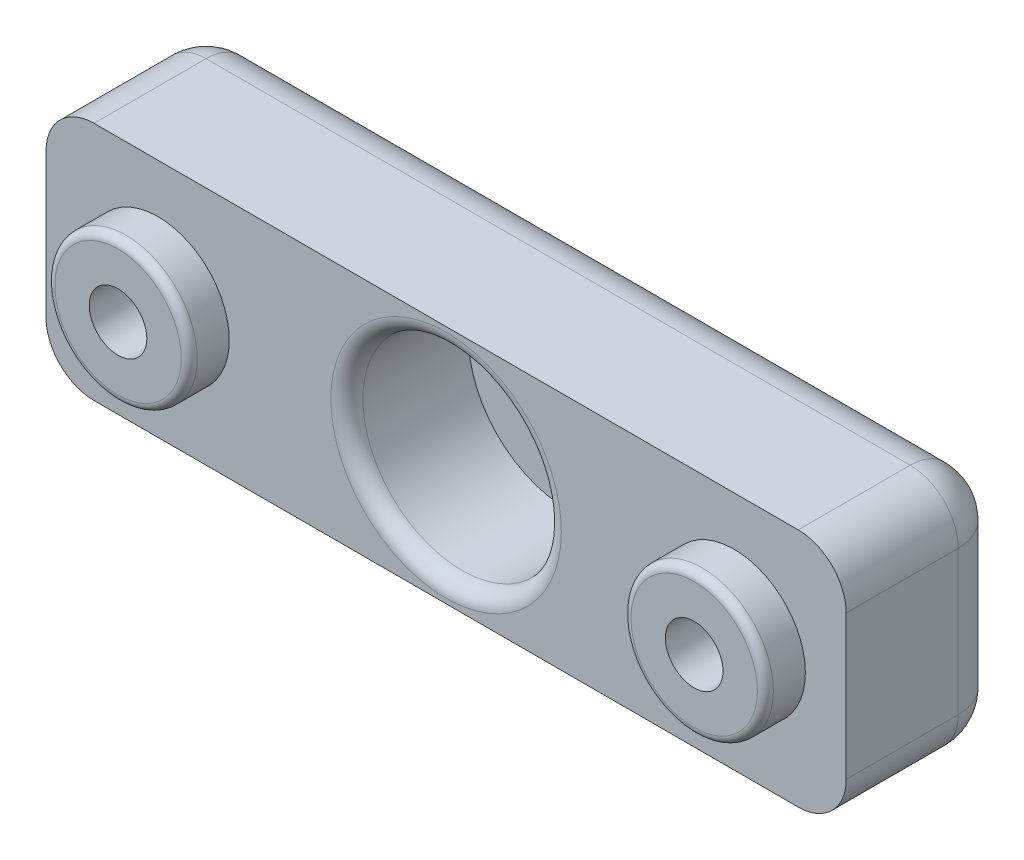
ISO-10303-21;
HEADER;
FILE_DESCRIPTION(('STEP AP214'),'2;1');
FILE_NAME('part.step','',(''),(''),'','','');
FILE_SCHEMA(('AUTOMOTIVE_DESIGN { 1 0 10303 214 1 1 1 1 }'));
ENDSEC;
DATA;
#1=APPLICATION_CONTEXT('core data for automotive mechanical design processes');
#2=APPLICATION_PROTOCOL_DEFINITION('international standard','automotive_design',2000,#1);
#3=PRODUCT_CONTEXT('',#1,'mechanical');
#4=PRODUCT('Part','Part','',(#3));
#5=PRODUCT_RELATED_PRODUCT_CATEGORY('part','',(#4));
#6=PRODUCT_DEFINITION_FORMATION('','',#4);
#7=PRODUCT_DEFINITION_CONTEXT('part definition',#1,'design');
#8=PRODUCT_DEFINITION('design','',#6,#7);
#9=PRODUCT_DEFINITION_SHAPE('','',#8);
#10=(LENGTH_UNIT() NAMED_UNIT(*) SI_UNIT(.MILLI.,.METRE.));
#11=(NAMED_UNIT(*) PLANE_ANGLE_UNIT() SI_UNIT($,.RADIAN.));
#12=(NAMED_UNIT(*) SI_UNIT($,.STERADIAN.) SOLID_ANGLE_UNIT());
#13=UNCERTAINTY_MEASURE_WITH_UNIT(LENGTH_MEASURE(1.E-05),#10,'distance_accuracy_value','');
#14=(GEOMETRIC_REPRESENTATION_CONTEXT(3) GLOBAL_UNCERTAINTY_ASSIGNED_CONTEXT((#13)) GLOBAL_UNIT_ASSIGNED_CONTEXT((#10,
#11,#12)) REPRESENTATION_CONTEXT('',''));
#15=CARTESIAN_POINT('',(0.,0.,0.));
#16=DIRECTION('',(0.,0.,1.));
#17=DIRECTION('',(1.,0.,0.));
#18=AXIS2_PLACEMENT_3D('',#15,#16,#17);
#19=CARTESIAN_POINT('',(-20.4300132750273,8.59792284866469,-3.));
#20=DIRECTION('',(0.,0.,1.));
#21=DIRECTION('',(1.,0.,0.));
#22=AXIS2_PLACEMENT_3D('',#19,#20,#21);
#23=CYLINDRICAL_SURFACE('',#22,1.8);
#24=CARTESIAN_POINT('',(-20.4300132750273,8.59792284866469,12.5));
#25=DIRECTION('',(0.,0.,1.));
#26=DIRECTION('',(1.,0.,0.));
#27=AXIS2_PLACEMENT_3D('',#24,#25,#26);
#28=CIRCLE('',#27,1.8);
#29=CARTESIAN_POINT('',(-18.6300132750273,8.59792284866469,12.5));
#30=VERTEX_POINT('',#29);
#31=EDGE_CURVE('E297',#30,#30,#28,.T.);
#32=ORIENTED_EDGE('',*,*,#31,.T.);
#33=EDGE_LOOP('',(#32));
#34=FACE_BOUND('',#33,.T.);
#35=CARTESIAN_POINT('',(-20.4300132750273,8.59792284866469,3.5));
#36=DIRECTION('',(0.,0.,-1.));
#37=DIRECTION('',(-1.,0.,0.));
#38=AXIS2_PLACEMENT_3D('',#35,#36,#37);
#39=CIRCLE('',#38,1.8);
#40=CARTESIAN_POINT('',(-22.2300132750273,8.59792284866469,3.5));
#41=VERTEX_POINT('',#40);
#42=EDGE_CURVE('E237',#41,#41,#39,.F.);
#43=ORIENTED_EDGE('',*,*,#42,.F.);
#44=EDGE_LOOP('',(#43));
#45=FACE_BOUND('',#44,.T.);
#46=ADVANCED_FACE('F35',(#34,#45),#23,.F.);
#47=CARTESIAN_POINT('',(15.5699867249727,8.59792284866469,-3.));
#48=DIRECTION('',(0.,0.,1.));
#49=DIRECTION('',(1.,0.,0.));
#50=AXIS2_PLACEMENT_3D('',#47,#48,#49);
#51=CYLINDRICAL_SURFACE('',#50,1.8);
#52=CARTESIAN_POINT('',(15.5699867249727,8.59792284866469,12.5));
#53=DIRECTION('',(0.,0.,1.));
#54=DIRECTION('',(1.,0.,0.));
#55=AXIS2_PLACEMENT_3D('',#52,#53,#54);
#56=CIRCLE('',#55,1.8);
#57=CARTESIAN_POINT('',(17.3699867249727,8.59792284866469,12.5));
#58=VERTEX_POINT('',#57);
#59=EDGE_CURVE('E294',#58,#58,#56,.T.);
#60=ORIENTED_EDGE('',*,*,#59,.T.);
#61=EDGE_LOOP('',(#60));
#62=FACE_BOUND('',#61,.T.);
#63=CARTESIAN_POINT('',(15.5699867249727,8.59792284866469,3.5));
#64=DIRECTION('',(0.,0.,-1.));
#65=DIRECTION('',(-1.,0.,0.));
#66=AXIS2_PLACEMENT_3D('',#63,#64,#65);
#67=CIRCLE('',#66,1.8);
#68=CARTESIAN_POINT('',(13.7699867249727,8.59792284866469,3.5));
#69=VERTEX_POINT('',#68);
#70=EDGE_CURVE('E283',#69,#69,#67,.F.);
#71=ORIENTED_EDGE('',*,*,#70,.F.);
#72=EDGE_LOOP('',(#71));
#73=FACE_BOUND('',#72,.T.);
#74=ADVANCED_FACE('F425',(#62,#73),#51,.F.);
#75=CARTESIAN_POINT('',(-27.4300132750273,16.0979228486647,10.));
#76=DIRECTION('',(1.,0.,0.));
#77=DIRECTION('',(0.,1.,0.));
#78=AXIS2_PLACEMENT_3D('',#75,#76,#77);
#79=PLANE('',#78);
#80=DIRECTION('',(0.,-1.,0.));
#81=VECTOR('',#80,1.);
#82=CARTESIAN_POINT('',(-27.4300132750273,16.0979228486647,3.));
#83=LINE('',#82,#81);
#84=CARTESIAN_POINT('',(-27.4300132750273,13.0979228486647,3.));
#85=VERTEX_POINT('',#84);
#86=CARTESIAN_POINT('',(-27.4300132750273,4.09792284866469,3.));
#87=VERTEX_POINT('',#86);
#88=EDGE_CURVE('E50',#85,#87,#83,.T.);
#89=ORIENTED_EDGE('',*,*,#88,.T.);
#90=DIRECTION('',(0.,0.,-1.));
#91=VECTOR('',#90,1.);
#92=CARTESIAN_POINT('',(-27.4300132750273,4.09792284866469,10.));
#93=LINE('',#92,#91);
#94=CARTESIAN_POINT('',(-27.4300132750273,4.09792284866469,10.));
#95=VERTEX_POINT('',#94);
#96=EDGE_CURVE('E363',#87,#95,#93,.F.);
#97=ORIENTED_EDGE('',*,*,#96,.T.);
#98=DIRECTION('',(0.,-1.,0.));
#99=VECTOR('',#98,1.);
#100=CARTESIAN_POINT('',(-27.4300132750273,16.0979228486647,10.));
#101=LINE('',#100,#99);
#102=CARTESIAN_POINT('',(-27.4300132750273,13.0979228486647,10.));
#103=VERTEX_POINT('',#102);
#104=EDGE_CURVE('E309',#103,#95,#101,.T.);
#105=ORIENTED_EDGE('',*,*,#104,.F.);
#106=DIRECTION('',(0.,0.,-1.));
#107=VECTOR('',#106,1.);
#108=CARTESIAN_POINT('',(-27.4300132750273,13.0979228486647,10.));
#109=LINE('',#108,#107);
#110=EDGE_CURVE('E55',#103,#85,#109,.T.);
#111=ORIENTED_EDGE('',*,*,#110,.T.);
#112=EDGE_LOOP('',(#89,#97,#105,#111));
#113=FACE_BOUND('',#112,.T.);
#114=ADVANCED_FACE('F431',(#113),#79,.F.);
#115=CARTESIAN_POINT('',(-27.4300132750273,1.09792284866469,10.));
#116=DIRECTION('',(0.,1.,0.));
#117=DIRECTION('',(0.,0.,1.));
#118=AXIS2_PLACEMENT_3D('',#115,#116,#117);
#119=PLANE('',#118);
#120=DIRECTION('',(1.,0.,0.));
#121=VECTOR('',#120,1.);
#122=CARTESIAN_POINT('',(-27.4300132750273,1.09792284866469,3.));
#123=LINE('',#122,#121);
#124=CARTESIAN_POINT('',(-24.4300132750273,1.09792284866469,3.));
#125=VERTEX_POINT('',#124);
#126=CARTESIAN_POINT('',(19.5699867249727,1.09792284866469,3.));
#127=VERTEX_POINT('',#126);
#128=EDGE_CURVE('E327',#125,#127,#123,.T.);
#129=ORIENTED_EDGE('',*,*,#128,.T.);
#130=DIRECTION('',(0.,0.,-1.));
#131=VECTOR('',#130,1.);
#132=CARTESIAN_POINT('',(19.5699867249727,1.09792284866469,10.));
#133=LINE('',#132,#131);
#134=CARTESIAN_POINT('',(19.5699867249727,1.09792284866469,10.));
#135=VERTEX_POINT('',#134);
#136=EDGE_CURVE('E330',#127,#135,#133,.F.);
#137=ORIENTED_EDGE('',*,*,#136,.T.);
#138=DIRECTION('',(1.,0.,0.));
#139=VECTOR('',#138,1.);
#140=CARTESIAN_POINT('',(-27.4300132750273,1.09792284866469,10.));
#141=LINE('',#140,#139);
#142=CARTESIAN_POINT('',(-24.4300132750273,1.09792284866469,10.));
#143=VERTEX_POINT('',#142);
#144=EDGE_CURVE('E312',#143,#135,#141,.T.);
#145=ORIENTED_EDGE('',*,*,#144,.F.);
#146=DIRECTION('',(0.,0.,-1.));
#147=VECTOR('',#146,1.);
#148=CARTESIAN_POINT('',(-24.4300132750273,1.09792284866469,10.));
#149=LINE('',#148,#147);
#150=EDGE_CURVE('E321',#143,#125,#149,.T.);
#151=ORIENTED_EDGE('',*,*,#150,.T.);
#152=EDGE_LOOP('',(#129,#137,#145,#151));
#153=FACE_BOUND('',#152,.T.);
#154=ADVANCED_FACE('F475',(#153),#119,.F.);
#155=CARTESIAN_POINT('',(22.5699867249727,16.0979228486647,10.));
#156=DIRECTION('',(-1.,0.,0.));
#157=DIRECTION('',(0.,-1.,0.));
#158=AXIS2_PLACEMENT_3D('',#155,#156,#157);
#159=PLANE('',#158);
#160=DIRECTION('',(0.,1.,0.));
#161=VECTOR('',#160,1.);
#162=CARTESIAN_POINT('',(22.5699867249727,16.0979228486647,10.));
#163=LINE('',#162,#161);
#164=CARTESIAN_POINT('',(22.5699867249727,4.09792284866469,10.));
#165=VERTEX_POINT('',#164);
#166=CARTESIAN_POINT('',(22.5699867249727,13.0979228486647,10.));
#167=VERTEX_POINT('',#166);
#168=EDGE_CURVE('E315',#165,#167,#163,.T.);
#169=ORIENTED_EDGE('',*,*,#168,.F.);
#170=DIRECTION('',(0.,0.,-1.));
#171=VECTOR('',#170,1.);
#172=CARTESIAN_POINT('',(22.5699867249727,4.09792284866469,10.));
#173=LINE('',#172,#171);
#174=CARTESIAN_POINT('',(22.5699867249727,4.09792284866469,3.));
#175=VERTEX_POINT('',#174);
#176=EDGE_CURVE('E345',#165,#175,#173,.T.);
#177=ORIENTED_EDGE('',*,*,#176,.T.);
#178=DIRECTION('',(0.,1.,0.));
#179=VECTOR('',#178,1.);
#180=CARTESIAN_POINT('',(22.5699867249727,16.0979228486647,3.));
#181=LINE('',#180,#179);
#182=CARTESIAN_POINT('',(22.5699867249727,13.0979228486647,3.));
#183=VERTEX_POINT('',#182);
#184=EDGE_CURVE('E341',#175,#183,#181,.T.);
#185=ORIENTED_EDGE('',*,*,#184,.T.);
#186=DIRECTION('',(0.,0.,-1.));
#187=VECTOR('',#186,1.);
#188=CARTESIAN_POINT('',(22.5699867249727,13.0979228486647,10.));
#189=LINE('',#188,#187);
#190=EDGE_CURVE('E343',#183,#167,#189,.F.);
#191=ORIENTED_EDGE('',*,*,#190,.T.);
#192=EDGE_LOOP('',(#169,#177,#185,#191));
#193=FACE_BOUND('',#192,.T.);
#194=ADVANCED_FACE('F471',(#193),#159,.F.);
#195=CARTESIAN_POINT('',(-27.4300132750273,16.0979228486647,10.));
#196=DIRECTION('',(0.,-1.,0.));
#197=DIRECTION('',(0.,0.,-1.));
#198=AXIS2_PLACEMENT_3D('',#195,#196,#197);
#199=PLANE('',#198);
#200=DIRECTION('',(-1.,0.,0.));
#201=VECTOR('',#200,1.);
#202=CARTESIAN_POINT('',(-27.4300132750273,16.0979228486647,10.));
#203=LINE('',#202,#201);
#204=CARTESIAN_POINT('',(19.5699867249727,16.0979228486647,10.));
#205=VERTEX_POINT('',#204);
#206=CARTESIAN_POINT('',(-24.4300132750273,16.0979228486647,10.));
#207=VERTEX_POINT('',#206);
#208=EDGE_CURVE('E318',#205,#207,#203,.T.);
#209=ORIENTED_EDGE('',*,*,#208,.F.);
#210=DIRECTION('',(0.,0.,-1.));
#211=VECTOR('',#210,1.);
#212=CARTESIAN_POINT('',(19.5699867249727,16.0979228486647,10.));
#213=LINE('',#212,#211);
#214=CARTESIAN_POINT('',(19.5699867249727,16.0979228486647,3.));
#215=VERTEX_POINT('',#214);
#216=EDGE_CURVE('E359',#205,#215,#213,.T.);
#217=ORIENTED_EDGE('',*,*,#216,.T.);
#218=DIRECTION('',(-1.,0.,0.));
#219=VECTOR('',#218,1.);
#220=CARTESIAN_POINT('',(-27.4300132750273,16.0979228486647,3.));
#221=LINE('',#220,#219);
#222=CARTESIAN_POINT('',(-24.4300132750273,16.0979228486647,3.));
#223=VERTEX_POINT('',#222);
#224=EDGE_CURVE('E355',#215,#223,#221,.T.);
#225=ORIENTED_EDGE('',*,*,#224,.T.);
#226=DIRECTION('',(0.,0.,-1.));
#227=VECTOR('',#226,1.);
#228=CARTESIAN_POINT('',(-24.4300132750273,16.0979228486647,10.));
#229=LINE('',#228,#227);
#230=EDGE_CURVE('E357',#223,#207,#229,.F.);
#231=ORIENTED_EDGE('',*,*,#230,.T.);
#232=EDGE_LOOP('',(#209,#217,#225,#231));
#233=FACE_BOUND('',#232,.T.);
#234=ADVANCED_FACE('F464',(#233),#199,.F.);
#235=CARTESIAN_POINT('',(0.,0.,10.));
#236=DIRECTION('',(0.,0.,1.));
#237=DIRECTION('',(1.,0.,0.));
#238=AXIS2_PLACEMENT_3D('',#235,#236,#237);
#239=PLANE('',#238);
#240=CARTESIAN_POINT('',(-2.43001327502733,8.59792284866469,10.));
#241=DIRECTION('',(0.,0.,1.));
#242=DIRECTION('',(1.,0.,0.));
#243=AXIS2_PLACEMENT_3D('',#240,#241,#242);
#244=CIRCLE('',#243,7.2);
#245=CARTESIAN_POINT('',(4.76998672497267,8.59792284866469,10.));
#246=VERTEX_POINT('',#245);
#247=EDGE_CURVE('E401',#246,#246,#244,.F.);
#248=ORIENTED_EDGE('',*,*,#247,.T.);
#249=EDGE_LOOP('',(#248));
#250=FACE_BOUND('',#249,.T.);
#251=CARTESIAN_POINT('',(15.5699867249727,8.59792284866469,10.));
#252=DIRECTION('',(0.,0.,1.));
#253=DIRECTION('',(1.,0.,0.));
#254=AXIS2_PLACEMENT_3D('',#251,#252,#253);
#255=CIRCLE('',#254,4.45);
#256=CARTESIAN_POINT('',(20.0199867249727,8.59792284866469,10.));
#257=VERTEX_POINT('',#256);
#258=EDGE_CURVE('E303',#257,#257,#255,.T.);
#259=ORIENTED_EDGE('',*,*,#258,.F.);
#260=EDGE_LOOP('',(#259));
#261=FACE_BOUND('',#260,.T.);
#262=CARTESIAN_POINT('',(-20.4300132750273,8.59792284866469,10.));
#263=DIRECTION('',(0.,0.,1.));
#264=DIRECTION('',(1.,0.,0.));
#265=AXIS2_PLACEMENT_3D('',#262,#263,#264);
#266=CIRCLE('',#265,4.45);
#267=CARTESIAN_POINT('',(-15.9800132750273,8.59792284866469,10.));
#268=VERTEX_POINT('',#267);
#269=EDGE_CURVE('E306',#268,#268,#266,.T.);
#270=ORIENTED_EDGE('',*,*,#269,.F.);
#271=EDGE_LOOP('',(#270));
#272=FACE_BOUND('',#271,.T.);
#273=ORIENTED_EDGE('',*,*,#144,.T.);
#274=CARTESIAN_POINT('',(19.5699867249727,4.09792284866469,10.));
#275=DIRECTION('',(0.,0.,1.));
#276=DIRECTION('',(1.,0.,0.));
#277=AXIS2_PLACEMENT_3D('',#274,#275,#276);
#278=CIRCLE('',#277,3.);
#279=EDGE_CURVE('E353',#135,#165,#278,.T.);
#280=ORIENTED_EDGE('',*,*,#279,.T.);
#281=ORIENTED_EDGE('',*,*,#168,.T.);
#282=CARTESIAN_POINT('',(19.5699867249727,13.0979228486647,10.));
#283=DIRECTION('',(0.,0.,1.));
#284=DIRECTION('',(1.,0.,0.));
#285=AXIS2_PLACEMENT_3D('',#282,#283,#284);
#286=CIRCLE('',#285,3.);
#287=EDGE_CURVE('E351',#167,#205,#286,.T.);
#288=ORIENTED_EDGE('',*,*,#287,.T.);
#289=ORIENTED_EDGE('',*,*,#208,.T.);
#290=CARTESIAN_POINT('',(-24.4300132750273,13.0979228486647,10.));
#291=DIRECTION('',(0.,0.,1.));
#292=DIRECTION('',(1.,0.,0.));
#293=AXIS2_PLACEMENT_3D('',#290,#291,#292);
#294=CIRCLE('',#293,3.);
#295=EDGE_CURVE('E347',#207,#103,#294,.T.);
#296=ORIENTED_EDGE('',*,*,#295,.T.);
#297=ORIENTED_EDGE('',*,*,#104,.T.);
#298=CARTESIAN_POINT('',(-24.4300132750273,4.09792284866469,10.));
#299=DIRECTION('',(0.,0.,1.));
#300=DIRECTION('',(1.,0.,0.));
#301=AXIS2_PLACEMENT_3D('',#298,#299,#300);
#302=CIRCLE('',#301,3.);
#303=EDGE_CURVE('E349',#95,#143,#302,.T.);
#304=ORIENTED_EDGE('',*,*,#303,.T.);
#305=EDGE_LOOP('',(#273,#280,#281,#288,#289,#296,#297,#304));
#306=FACE_BOUND('',#305,.T.);
#307=ADVANCED_FACE('F461',(#250,#261,#272,#306),#239,.T.);
#308=CARTESIAN_POINT('',(0.,0.,0.));
#309=DIRECTION('',(0.,0.,1.));
#310=DIRECTION('',(1.,0.,0.));
#311=AXIS2_PLACEMENT_3D('',#308,#309,#310);
#312=PLANE('',#311);
#313=DIRECTION('',(0.,1.,0.));
#314=VECTOR('',#313,1.);
#315=CARTESIAN_POINT('',(19.5699867249727,0.,0.));
#316=LINE('',#315,#314);
#317=CARTESIAN_POINT('',(19.5699867249727,13.0979228486647,0.));
#318=VERTEX_POINT('',#317);
#319=CARTESIAN_POINT('',(19.5699867249727,4.09792284866469,0.));
#320=VERTEX_POINT('',#319);
#321=EDGE_CURVE('E336',#318,#320,#316,.F.);
#322=ORIENTED_EDGE('',*,*,#321,.T.);
#323=DIRECTION('',(1.,0.,0.));
#324=VECTOR('',#323,1.);
#325=CARTESIAN_POINT('',(0.,4.09792284866469,0.));
#326=LINE('',#325,#324);
#327=CARTESIAN_POINT('',(-24.4300132750273,4.09792284866469,0.));
#328=VERTEX_POINT('',#327);
#329=EDGE_CURVE('E338',#320,#328,#326,.F.);
#330=ORIENTED_EDGE('',*,*,#329,.T.);
#331=DIRECTION('',(0.,-1.,0.));
#332=VECTOR('',#331,1.);
#333=CARTESIAN_POINT('',(-24.4300132750273,0.,0.));
#334=LINE('',#333,#332);
#335=CARTESIAN_POINT('',(-24.4300132750273,13.0979228486647,0.));
#336=VERTEX_POINT('',#335);
#337=EDGE_CURVE('E334',#328,#336,#334,.F.);
#338=ORIENTED_EDGE('',*,*,#337,.T.);
#339=DIRECTION('',(-1.,0.,0.));
#340=VECTOR('',#339,1.);
#341=CARTESIAN_POINT('',(0.,13.0979228486647,0.));
#342=LINE('',#341,#340);
#343=EDGE_CURVE('E332',#336,#318,#342,.F.);
#344=ORIENTED_EDGE('',*,*,#343,.T.);
#345=EDGE_LOOP('',(#322,#330,#338,#344));
#346=FACE_BOUND('',#345,.T.);
#347=DIRECTION('',(0.5,0.866025403784439,0.));
#348=VECTOR('',#347,1.);
#349=CARTESIAN_POINT('',(-23.951849917084,8.59792284866469,0.));
#350=LINE('',#349,#348);
#351=CARTESIAN_POINT('',(-23.951849917084,8.59792284866469,0.));
#352=VERTEX_POINT('',#351);
#353=CARTESIAN_POINT('',(-22.1909315960557,11.6479228486647,0.));
#354=VERTEX_POINT('',#353);
#355=EDGE_CURVE('E224',#352,#354,#350,.T.);
#356=ORIENTED_EDGE('',*,*,#355,.F.);
#357=DIRECTION('',(-0.5,0.866025403784439,0.));
#358=VECTOR('',#357,1.);
#359=CARTESIAN_POINT('',(-22.1909315960557,5.54792284866469,0.));
#360=LINE('',#359,#358);
#361=CARTESIAN_POINT('',(-22.1909315960557,5.54792284866469,0.));
#362=VERTEX_POINT('',#361);
#363=EDGE_CURVE('E191',#362,#352,#360,.T.);
#364=ORIENTED_EDGE('',*,*,#363,.F.);
#365=DIRECTION('',(-1.,0.,0.));
#366=VECTOR('',#365,1.);
#367=CARTESIAN_POINT('',(-18.669094953999,5.54792284866469,0.));
#368=LINE('',#367,#366);
#369=CARTESIAN_POINT('',(-18.669094953999,5.54792284866469,0.));
#370=VERTEX_POINT('',#369);
#371=EDGE_CURVE('E210',#370,#362,#368,.T.);
#372=ORIENTED_EDGE('',*,*,#371,.F.);
#373=DIRECTION('',(-0.500000000000001,-0.866025403784438,0.));
#374=VECTOR('',#373,1.);
#375=CARTESIAN_POINT('',(-16.9081766329706,8.59792284866469,0.));
#376=LINE('',#375,#374);
#377=CARTESIAN_POINT('',(-16.9081766329706,8.59792284866469,0.));
#378=VERTEX_POINT('',#377);
#379=EDGE_CURVE('E213',#378,#370,#376,.T.);
#380=ORIENTED_EDGE('',*,*,#379,.F.);
#381=DIRECTION('',(0.500000000000001,-0.866025403784438,0.));
#382=VECTOR('',#381,1.);
#383=CARTESIAN_POINT('',(-18.669094953999,11.6479228486647,0.));
#384=LINE('',#383,#382);
#385=CARTESIAN_POINT('',(-18.669094953999,11.6479228486647,0.));
#386=VERTEX_POINT('',#385);
#387=EDGE_CURVE('E230',#386,#378,#384,.T.);
#388=ORIENTED_EDGE('',*,*,#387,.F.);
#389=DIRECTION('',(1.,0.,0.));
#390=VECTOR('',#389,1.);
#391=CARTESIAN_POINT('',(-22.1909315960557,11.6479228486647,0.));
#392=LINE('',#391,#390);
#393=EDGE_CURVE('E227',#354,#386,#392,.T.);
#394=ORIENTED_EDGE('',*,*,#393,.F.);
#395=EDGE_LOOP('',(#356,#364,#372,#380,#388,#394));
#396=FACE_BOUND('',#395,.T.);
#397=DIRECTION('',(0.5,0.866025403784439,0.));
#398=VECTOR('',#397,1.);
#399=CARTESIAN_POINT('',(12.048150082916,8.59792284866469,0.));
#400=LINE('',#399,#398);
#401=CARTESIAN_POINT('',(12.048150082916,8.59792284866469,0.));
#402=VERTEX_POINT('',#401);
#403=CARTESIAN_POINT('',(13.8090684039443,11.6479228486647,0.));
#404=VERTEX_POINT('',#403);
#405=EDGE_CURVE('E267',#402,#404,#400,.T.);
#406=ORIENTED_EDGE('',*,*,#405,.F.);
#407=DIRECTION('',(-0.5,0.866025403784439,0.));
#408=VECTOR('',#407,1.);
#409=CARTESIAN_POINT('',(13.8090684039443,5.54792284866469,0.));
#410=LINE('',#409,#408);
#411=CARTESIAN_POINT('',(13.8090684039443,5.54792284866469,0.));
#412=VERTEX_POINT('',#411);
#413=EDGE_CURVE('E265',#412,#402,#410,.T.);
#414=ORIENTED_EDGE('',*,*,#413,.F.);
#415=DIRECTION('',(-1.,0.,0.));
#416=VECTOR('',#415,1.);
#417=CARTESIAN_POINT('',(17.330905046001,5.54792284866469,0.));
#418=LINE('',#417,#416);
#419=CARTESIAN_POINT('',(17.330905046001,5.54792284866469,0.));
#420=VERTEX_POINT('',#419);
#421=EDGE_CURVE('E249',#420,#412,#418,.T.);
#422=ORIENTED_EDGE('',*,*,#421,.F.);
#423=DIRECTION('',(-0.5,-0.866025403784439,0.));
#424=VECTOR('',#423,1.);
#425=CARTESIAN_POINT('',(19.0918233670294,8.59792284866469,0.));
#426=LINE('',#425,#424);
#427=CARTESIAN_POINT('',(19.0918233670294,8.59792284866469,0.));
#428=VERTEX_POINT('',#427);
#429=EDGE_CURVE('E276',#428,#420,#426,.T.);
#430=ORIENTED_EDGE('',*,*,#429,.F.);
#431=DIRECTION('',(0.5,-0.866025403784439,0.));
#432=VECTOR('',#431,1.);
#433=CARTESIAN_POINT('',(17.330905046001,11.6479228486647,0.));
#434=LINE('',#433,#432);
#435=CARTESIAN_POINT('',(17.330905046001,11.6479228486647,0.));
#436=VERTEX_POINT('',#435);
#437=EDGE_CURVE('E273',#436,#428,#434,.T.);
#438=ORIENTED_EDGE('',*,*,#437,.F.);
#439=DIRECTION('',(1.,0.,0.));
#440=VECTOR('',#439,1.);
#441=CARTESIAN_POINT('',(13.8090684039443,11.6479228486647,0.));
#442=LINE('',#441,#440);
#443=EDGE_CURVE('E270',#404,#436,#442,.T.);
#444=ORIENTED_EDGE('',*,*,#443,.F.);
#445=EDGE_LOOP('',(#406,#414,#422,#430,#438,#444));
#446=FACE_BOUND('',#445,.T.);
#447=ADVANCED_FACE('F459',(#346,#396,#446),#312,.F.);
#448=CARTESIAN_POINT('',(-20.4300132750273,8.59792284866469,12.5));
#449=DIRECTION('',(0.,0.,-1.));
#450=DIRECTION('',(-1.,0.,0.));
#451=AXIS2_PLACEMENT_3D('',#448,#449,#450);
#452=CYLINDRICAL_SURFACE('',#451,4.45);
#453=CARTESIAN_POINT('',(-20.4300132750273,8.59792284866469,12.));
#454=DIRECTION('',(0.,0.,1.));
#455=DIRECTION('',(1.,0.,0.));
#456=AXIS2_PLACEMENT_3D('',#453,#454,#455);
#457=CIRCLE('',#456,4.45);
#458=CARTESIAN_POINT('',(-15.9800132750273,8.59792284866469,12.));
#459=VERTEX_POINT('',#458);
#460=EDGE_CURVE('E11',#459,#459,#457,.F.);
#461=ORIENTED_EDGE('',*,*,#460,.T.);
#462=EDGE_LOOP('',(#461));
#463=FACE_BOUND('',#462,.T.);
#464=ORIENTED_EDGE('',*,*,#269,.T.);
#465=EDGE_LOOP('',(#464));
#466=FACE_BOUND('',#465,.T.);
#467=ADVANCED_FACE('F456',(#463,#466),#452,.T.);
#468=CARTESIAN_POINT('',(-20.4300132750273,8.59792284866469,12.5));
#469=DIRECTION('',(0.,0.,1.));
#470=DIRECTION('',(1.,0.,0.));
#471=AXIS2_PLACEMENT_3D('',#468,#469,#470);
#472=PLANE('',#471);
#473=CARTESIAN_POINT('',(-20.4300132750273,8.59792284866469,12.5));
#474=DIRECTION('',(0.,0.,1.));
#475=DIRECTION('',(1.,0.,0.));
#476=AXIS2_PLACEMENT_3D('',#473,#474,#475);
#477=CIRCLE('',#476,3.95);
#478=CARTESIAN_POINT('',(-16.4800132750273,8.59792284866469,12.5));
#479=VERTEX_POINT('',#478);
#480=EDGE_CURVE('E43',#479,#479,#477,.T.);
#481=ORIENTED_EDGE('',*,*,#480,.T.);
#482=EDGE_LOOP('',(#481));
#483=FACE_BOUND('',#482,.T.);
#484=ORIENTED_EDGE('',*,*,#31,.F.);
#485=EDGE_LOOP('',(#484));
#486=FACE_BOUND('',#485,.T.);
#487=ADVANCED_FACE('F412',(#483,#486),#472,.T.);
#488=CARTESIAN_POINT('',(15.5699867249727,8.59792284866469,12.5));
#489=DIRECTION('',(0.,0.,-1.));
#490=DIRECTION('',(-1.,0.,0.));
#491=AXIS2_PLACEMENT_3D('',#488,#489,#490);
#492=CYLINDRICAL_SURFACE('',#491,4.45);
#493=CARTESIAN_POINT('',(15.5699867249727,8.59792284866469,12.));
#494=DIRECTION('',(0.,0.,1.));
#495=DIRECTION('',(1.,0.,0.));
#496=AXIS2_PLACEMENT_3D('',#493,#494,#495);
#497=CIRCLE('',#496,4.45);
#498=CARTESIAN_POINT('',(20.0199867249727,8.59792284866469,12.));
#499=VERTEX_POINT('',#498);
#500=EDGE_CURVE('E407',#499,#499,#497,.F.);
#501=ORIENTED_EDGE('',*,*,#500,.T.);
#502=EDGE_LOOP('',(#501));
#503=FACE_BOUND('',#502,.T.);
#504=ORIENTED_EDGE('',*,*,#258,.T.);
#505=EDGE_LOOP('',(#504));
#506=FACE_BOUND('',#505,.T.);
#507=ADVANCED_FACE('F449',(#503,#506),#492,.T.);
#508=CARTESIAN_POINT('',(15.5699867249727,8.59792284866469,12.5));
#509=DIRECTION('',(0.,0.,1.));
#510=DIRECTION('',(1.,0.,0.));
#511=AXIS2_PLACEMENT_3D('',#508,#509,#510);
#512=PLANE('',#511);
#513=CARTESIAN_POINT('',(15.5699867249727,8.59792284866469,12.5));
#514=DIRECTION('',(0.,0.,1.));
#515=DIRECTION('',(1.,0.,0.));
#516=AXIS2_PLACEMENT_3D('',#513,#514,#515);
#517=CIRCLE('',#516,3.95);
#518=CARTESIAN_POINT('',(19.5199867249727,8.59792284866469,12.5));
#519=VERTEX_POINT('',#518);
#520=EDGE_CURVE('E404',#519,#519,#517,.T.);
#521=ORIENTED_EDGE('',*,*,#520,.T.);
#522=EDGE_LOOP('',(#521));
#523=FACE_BOUND('',#522,.T.);
#524=ORIENTED_EDGE('',*,*,#59,.F.);
#525=EDGE_LOOP('',(#524));
#526=FACE_BOUND('',#525,.T.);
#527=ADVANCED_FACE('F445',(#523,#526),#512,.T.);
#528=CARTESIAN_POINT('',(-2.43001327502733,8.59792284866469,2.4));
#529=DIRECTION('',(0.,0.,1.));
#530=DIRECTION('',(1.,0.,0.));
#531=AXIS2_PLACEMENT_3D('',#528,#529,#530);
#532=CYLINDRICAL_SURFACE('',#531,6.2);
#533=CARTESIAN_POINT('',(-2.43001327502733,8.59792284866469,9.));
#534=DIRECTION('',(0.,0.,1.));
#535=DIRECTION('',(1.,0.,0.));
#536=AXIS2_PLACEMENT_3D('',#533,#534,#535);
#537=CIRCLE('',#536,6.2);
#538=CARTESIAN_POINT('',(3.76998672497267,8.59792284866469,9.));
#539=VERTEX_POINT('',#538);
#540=EDGE_CURVE('E365',#539,#539,#537,.T.);
#541=ORIENTED_EDGE('',*,*,#540,.T.);
#542=EDGE_LOOP('',(#541));
#543=FACE_BOUND('',#542,.T.);
#544=CARTESIAN_POINT('',(-2.43001327502733,8.59792284866469,2.4));
#545=DIRECTION('',(0.,0.,1.));
#546=DIRECTION('',(1.,0.,0.));
#547=AXIS2_PLACEMENT_3D('',#544,#545,#546);
#548=CIRCLE('',#547,6.2);
#549=CARTESIAN_POINT('',(3.76998672497267,8.59792284866469,2.4));
#550=VERTEX_POINT('',#549);
#551=EDGE_CURVE('E300',#550,#550,#548,.T.);
#552=ORIENTED_EDGE('',*,*,#551,.F.);
#553=EDGE_LOOP('',(#552));
#554=FACE_BOUND('',#553,.T.);
#555=ADVANCED_FACE('F441',(#543,#554),#532,.F.);
#556=CARTESIAN_POINT('',(-2.43001327502733,8.59792284866469,2.4));
#557=DIRECTION('',(0.,0.,1.));
#558=DIRECTION('',(1.,0.,0.));
#559=AXIS2_PLACEMENT_3D('',#556,#557,#558);
#560=PLANE('',#559);
#561=ORIENTED_EDGE('',*,*,#551,.T.);
#562=EDGE_LOOP('',(#561));
#563=FACE_BOUND('',#562,.T.);
#564=ADVANCED_FACE('F437',(#563),#560,.T.);
#565=CARTESIAN_POINT('',(0.,0.,3.5));
#566=DIRECTION('',(0.,0.,-1.));
#567=DIRECTION('',(-1.,0.,0.));
#568=AXIS2_PLACEMENT_3D('',#565,#566,#567);
#569=PLANE('',#568);
#570=DIRECTION('',(-0.5,0.866025403784439,0.));
#571=VECTOR('',#570,1.);
#572=CARTESIAN_POINT('',(13.8090684039443,5.54792284866469,3.5));
#573=LINE('',#572,#571);
#574=CARTESIAN_POINT('',(13.8090684039443,5.54792284866469,3.5));
#575=VERTEX_POINT('',#574);
#576=CARTESIAN_POINT('',(12.048150082916,8.59792284866469,3.5));
#577=VERTEX_POINT('',#576);
#578=EDGE_CURVE('E245',#575,#577,#573,.T.);
#579=ORIENTED_EDGE('',*,*,#578,.T.);
#580=DIRECTION('',(0.5,0.866025403784439,0.));
#581=VECTOR('',#580,1.);
#582=CARTESIAN_POINT('',(12.048150082916,8.59792284866469,3.5));
#583=LINE('',#582,#581);
#584=CARTESIAN_POINT('',(13.8090684039443,11.6479228486647,3.5));
#585=VERTEX_POINT('',#584);
#586=EDGE_CURVE('E248',#577,#585,#583,.T.);
#587=ORIENTED_EDGE('',*,*,#586,.T.);
#588=DIRECTION('',(1.,0.,0.));
#589=VECTOR('',#588,1.);
#590=CARTESIAN_POINT('',(13.8090684039443,11.6479228486647,3.5));
#591=LINE('',#590,#589);
#592=CARTESIAN_POINT('',(17.330905046001,11.6479228486647,3.5));
#593=VERTEX_POINT('',#592);
#594=EDGE_CURVE('E252',#585,#593,#591,.T.);
#595=ORIENTED_EDGE('',*,*,#594,.T.);
#596=DIRECTION('',(0.5,-0.866025403784439,0.));
#597=VECTOR('',#596,1.);
#598=CARTESIAN_POINT('',(17.330905046001,11.6479228486647,3.5));
#599=LINE('',#598,#597);
#600=CARTESIAN_POINT('',(19.0918233670294,8.59792284866469,3.5));
#601=VERTEX_POINT('',#600);
#602=EDGE_CURVE('E255',#593,#601,#599,.T.);
#603=ORIENTED_EDGE('',*,*,#602,.T.);
#604=DIRECTION('',(-0.5,-0.866025403784439,0.));
#605=VECTOR('',#604,1.);
#606=CARTESIAN_POINT('',(19.0918233670294,8.59792284866469,3.5));
#607=LINE('',#606,#605);
#608=CARTESIAN_POINT('',(17.330905046001,5.54792284866469,3.5));
#609=VERTEX_POINT('',#608);
#610=EDGE_CURVE('E258',#601,#609,#607,.T.);
#611=ORIENTED_EDGE('',*,*,#610,.T.);
#612=DIRECTION('',(-1.,0.,0.));
#613=VECTOR('',#612,1.);
#614=CARTESIAN_POINT('',(17.330905046001,5.54792284866469,3.5));
#615=LINE('',#614,#613);
#616=EDGE_CURVE('E261',#609,#575,#615,.T.);
#617=ORIENTED_EDGE('',*,*,#616,.T.);
#618=EDGE_LOOP('',(#579,#587,#595,#603,#611,#617));
#619=FACE_BOUND('',#618,.T.);
#620=ORIENTED_EDGE('',*,*,#70,.T.);
#621=EDGE_LOOP('',(#620));
#622=FACE_BOUND('',#621,.T.);
#623=ADVANCED_FACE('F440',(#619,#622),#569,.T.);
#624=CARTESIAN_POINT('',(13.8090684039443,5.54792284866469,3.5));
#625=DIRECTION('',(-0.866025403784439,-0.5,0.));
#626=DIRECTION('',(0.5,-0.866025403784439,0.));
#627=AXIS2_PLACEMENT_3D('',#624,#625,#626);
#628=PLANE('',#627);
#629=ORIENTED_EDGE('',*,*,#413,.T.);
#630=DIRECTION('',(0.,0.,-1.));
#631=VECTOR('',#630,1.);
#632=CARTESIAN_POINT('',(12.048150082916,8.59792284866469,3.5));
#633=LINE('',#632,#631);
#634=EDGE_CURVE('E264',#577,#402,#633,.T.);
#635=ORIENTED_EDGE('',*,*,#634,.F.);
#636=ORIENTED_EDGE('',*,*,#578,.F.);
#637=DIRECTION('',(0.,0.,-1.));
#638=VECTOR('',#637,1.);
#639=CARTESIAN_POINT('',(13.8090684039443,5.54792284866469,3.5));
#640=LINE('',#639,#638);
#641=EDGE_CURVE('E281',#575,#412,#640,.T.);
#642=ORIENTED_EDGE('',*,*,#641,.T.);
#643=EDGE_LOOP('',(#629,#635,#636,#642));
#644=FACE_BOUND('',#643,.T.);
#645=ADVANCED_FACE('F589',(#644),#628,.F.);
#646=CARTESIAN_POINT('',(17.330905046001,5.54792284866469,3.5));
#647=DIRECTION('',(0.,-1.,0.));
#648=DIRECTION('',(1.,0.,0.));
#649=AXIS2_PLACEMENT_3D('',#646,#647,#648);
#650=PLANE('',#649);
#651=ORIENTED_EDGE('',*,*,#421,.T.);
#652=ORIENTED_EDGE('',*,*,#641,.F.);
#653=ORIENTED_EDGE('',*,*,#616,.F.);
#654=DIRECTION('',(0.,0.,-1.));
#655=VECTOR('',#654,1.);
#656=CARTESIAN_POINT('',(17.330905046001,5.54792284866469,3.5));
#657=LINE('',#656,#655);
#658=EDGE_CURVE('E284',#609,#420,#657,.T.);
#659=ORIENTED_EDGE('',*,*,#658,.T.);
#660=EDGE_LOOP('',(#651,#652,#653,#659));
#661=FACE_BOUND('',#660,.T.);
#662=ADVANCED_FACE('F592',(#661),#650,.F.);
#663=CARTESIAN_POINT('',(19.0918233670294,8.59792284866469,3.5));
#664=DIRECTION('',(0.866025403784439,-0.5,0.));
#665=DIRECTION('',(0.5,0.866025403784439,0.));
#666=AXIS2_PLACEMENT_3D('',#663,#664,#665);
#667=PLANE('',#666);
#668=ORIENTED_EDGE('',*,*,#429,.T.);
#669=ORIENTED_EDGE('',*,*,#658,.F.);
#670=ORIENTED_EDGE('',*,*,#610,.F.);
#671=DIRECTION('',(0.,0.,-1.));
#672=VECTOR('',#671,1.);
#673=CARTESIAN_POINT('',(19.0918233670294,8.59792284866469,3.5));
#674=LINE('',#673,#672);
#675=EDGE_CURVE('E286',#601,#428,#674,.T.);
#676=ORIENTED_EDGE('',*,*,#675,.T.);
#677=EDGE_LOOP('',(#668,#669,#670,#676));
#678=FACE_BOUND('',#677,.T.);
#679=ADVANCED_FACE('F595',(#678),#667,.F.);
#680=CARTESIAN_POINT('',(17.330905046001,11.6479228486647,3.5));
#681=DIRECTION('',(0.866025403784439,0.5,0.));
#682=DIRECTION('',(-0.5,0.866025403784439,0.));
#683=AXIS2_PLACEMENT_3D('',#680,#681,#682);
#684=PLANE('',#683);
#685=ORIENTED_EDGE('',*,*,#437,.T.);
#686=ORIENTED_EDGE('',*,*,#675,.F.);
#687=ORIENTED_EDGE('',*,*,#602,.F.);
#688=DIRECTION('',(0.,0.,-1.));
#689=VECTOR('',#688,1.);
#690=CARTESIAN_POINT('',(17.330905046001,11.6479228486647,3.5));
#691=LINE('',#690,#689);
#692=EDGE_CURVE('E288',#593,#436,#691,.T.);
#693=ORIENTED_EDGE('',*,*,#692,.T.);
#694=EDGE_LOOP('',(#685,#686,#687,#693));
#695=FACE_BOUND('',#694,.T.);
#696=ADVANCED_FACE('F599',(#695),#684,.F.);
#697=CARTESIAN_POINT('',(13.8090684039443,11.6479228486647,3.5));
#698=DIRECTION('',(0.,1.,0.));
#699=DIRECTION('',(0.,0.,1.));
#700=AXIS2_PLACEMENT_3D('',#697,#698,#699);
#701=PLANE('',#700);
#702=ORIENTED_EDGE('',*,*,#443,.T.);
#703=ORIENTED_EDGE('',*,*,#692,.F.);
#704=ORIENTED_EDGE('',*,*,#594,.F.);
#705=DIRECTION('',(0.,0.,-1.));
#706=VECTOR('',#705,1.);
#707=CARTESIAN_POINT('',(13.8090684039443,11.6479228486647,3.5));
#708=LINE('',#707,#706);
#709=EDGE_CURVE('E290',#585,#404,#708,.T.);
#710=ORIENTED_EDGE('',*,*,#709,.T.);
#711=EDGE_LOOP('',(#702,#703,#704,#710));
#712=FACE_BOUND('',#711,.T.);
#713=ADVANCED_FACE('F601',(#712),#701,.F.);
#714=CARTESIAN_POINT('',(12.048150082916,8.59792284866469,3.5));
#715=DIRECTION('',(-0.866025403784439,0.5,0.));
#716=DIRECTION('',(-0.5,-0.866025403784439,0.));
#717=AXIS2_PLACEMENT_3D('',#714,#715,#716);
#718=PLANE('',#717);
#719=ORIENTED_EDGE('',*,*,#405,.T.);
#720=ORIENTED_EDGE('',*,*,#709,.F.);
#721=ORIENTED_EDGE('',*,*,#586,.F.);
#722=ORIENTED_EDGE('',*,*,#634,.T.);
#723=EDGE_LOOP('',(#719,#720,#721,#722));
#724=FACE_BOUND('',#723,.T.);
#725=ADVANCED_FACE('F584',(#724),#718,.F.);
#726=CARTESIAN_POINT('',(0.,0.,3.5));
#727=DIRECTION('',(0.,0.,-1.));
#728=DIRECTION('',(-1.,0.,0.));
#729=AXIS2_PLACEMENT_3D('',#726,#727,#728);
#730=PLANE('',#729);
#731=DIRECTION('',(-0.5,0.866025403784439,0.));
#732=VECTOR('',#731,1.);
#733=CARTESIAN_POINT('',(-22.1909315960557,5.54792284866469,3.5));
#734=LINE('',#733,#732);
#735=CARTESIAN_POINT('',(-22.1909315960557,5.54792284866469,3.5));
#736=VERTEX_POINT('',#735);
#737=CARTESIAN_POINT('',(-23.951849917084,8.59792284866469,3.5));
#738=VERTEX_POINT('',#737);
#739=EDGE_CURVE('E188',#736,#738,#734,.T.);
#740=ORIENTED_EDGE('',*,*,#739,.T.);
#741=DIRECTION('',(0.5,0.866025403784439,0.));
#742=VECTOR('',#741,1.);
#743=CARTESIAN_POINT('',(-23.951849917084,8.59792284866469,3.5));
#744=LINE('',#743,#742);
#745=CARTESIAN_POINT('',(-22.1909315960557,11.6479228486647,3.5));
#746=VERTEX_POINT('',#745);
#747=EDGE_CURVE('E199',#738,#746,#744,.T.);
#748=ORIENTED_EDGE('',*,*,#747,.T.);
#749=DIRECTION('',(1.,0.,0.));
#750=VECTOR('',#749,1.);
#751=CARTESIAN_POINT('',(-22.1909315960557,11.6479228486647,3.5));
#752=LINE('',#751,#750);
#753=CARTESIAN_POINT('',(-18.669094953999,11.6479228486647,3.5));
#754=VERTEX_POINT('',#753);
#755=EDGE_CURVE('E204',#746,#754,#752,.T.);
#756=ORIENTED_EDGE('',*,*,#755,.T.);
#757=DIRECTION('',(0.500000000000001,-0.866025403784438,0.));
#758=VECTOR('',#757,1.);
#759=CARTESIAN_POINT('',(-18.669094953999,11.6479228486647,3.5));
#760=LINE('',#759,#758);
#761=CARTESIAN_POINT('',(-16.9081766329706,8.59792284866469,3.5));
#762=VERTEX_POINT('',#761);
#763=EDGE_CURVE('E217',#754,#762,#760,.T.);
#764=ORIENTED_EDGE('',*,*,#763,.T.);
#765=DIRECTION('',(-0.500000000000001,-0.866025403784438,0.));
#766=VECTOR('',#765,1.);
#767=CARTESIAN_POINT('',(-16.9081766329706,8.59792284866469,3.5));
#768=LINE('',#767,#766);
#769=CARTESIAN_POINT('',(-18.669094953999,5.54792284866469,3.5));
#770=VERTEX_POINT('',#769);
#771=EDGE_CURVE('E220',#762,#770,#768,.T.);
#772=ORIENTED_EDGE('',*,*,#771,.T.);
#773=DIRECTION('',(-1.,0.,0.));
#774=VECTOR('',#773,1.);
#775=CARTESIAN_POINT('',(-18.669094953999,5.54792284866469,3.5));
#776=LINE('',#775,#774);
#777=EDGE_CURVE('E196',#770,#736,#776,.T.);
#778=ORIENTED_EDGE('',*,*,#777,.T.);
#779=EDGE_LOOP('',(#740,#748,#756,#764,#772,#778));
#780=FACE_BOUND('',#779,.T.);
#781=ORIENTED_EDGE('',*,*,#42,.T.);
#782=EDGE_LOOP('',(#781));
#783=FACE_BOUND('',#782,.T.);
#784=ADVANCED_FACE('F206',(#780,#783),#730,.T.);
#785=CARTESIAN_POINT('',(-22.1909315960557,5.54792284866469,3.5));
#786=DIRECTION('',(-0.866025403784439,-0.5,0.));
#787=DIRECTION('',(0.5,-0.866025403784439,0.));
#788=AXIS2_PLACEMENT_3D('',#785,#786,#787);
#789=PLANE('',#788);
#790=ORIENTED_EDGE('',*,*,#363,.T.);
#791=DIRECTION('',(0.,0.,-1.));
#792=VECTOR('',#791,1.);
#793=CARTESIAN_POINT('',(-23.951849917084,8.59792284866469,3.5));
#794=LINE('',#793,#792);
#795=EDGE_CURVE('E184',#738,#352,#794,.T.);
#796=ORIENTED_EDGE('',*,*,#795,.F.);
#797=ORIENTED_EDGE('',*,*,#739,.F.);
#798=DIRECTION('',(0.,0.,-1.));
#799=VECTOR('',#798,1.);
#800=CARTESIAN_POINT('',(-22.1909315960557,5.54792284866469,3.5));
#801=LINE('',#800,#799);
#802=EDGE_CURVE('E235',#736,#362,#801,.T.);
#803=ORIENTED_EDGE('',*,*,#802,.T.);
#804=EDGE_LOOP('',(#790,#796,#797,#803));
#805=FACE_BOUND('',#804,.T.);
#806=ADVANCED_FACE('F186',(#805),#789,.F.);
#807=CARTESIAN_POINT('',(-18.669094953999,5.54792284866469,3.5));
#808=DIRECTION('',(0.,-1.,0.));
#809=DIRECTION('',(0.,0.,-1.));
#810=AXIS2_PLACEMENT_3D('',#807,#808,#809);
#811=PLANE('',#810);
#812=ORIENTED_EDGE('',*,*,#371,.T.);
#813=ORIENTED_EDGE('',*,*,#802,.F.);
#814=ORIENTED_EDGE('',*,*,#777,.F.);
#815=DIRECTION('',(0.,0.,-1.));
#816=VECTOR('',#815,1.);
#817=CARTESIAN_POINT('',(-18.669094953999,5.54792284866469,3.5));
#818=LINE('',#817,#816);
#819=EDGE_CURVE('E238',#770,#370,#818,.T.);
#820=ORIENTED_EDGE('',*,*,#819,.T.);
#821=EDGE_LOOP('',(#812,#813,#814,#820));
#822=FACE_BOUND('',#821,.T.);
#823=ADVANCED_FACE('F630',(#822),#811,.F.);
#824=CARTESIAN_POINT('',(-16.9081766329706,8.59792284866469,3.5));
#825=DIRECTION('',(0.866025403784438,-0.500000000000001,0.));
#826=DIRECTION('',(0.500000000000001,0.866025403784438,0.));
#827=AXIS2_PLACEMENT_3D('',#824,#825,#826);
#828=PLANE('',#827);
#829=ORIENTED_EDGE('',*,*,#379,.T.);
#830=ORIENTED_EDGE('',*,*,#819,.F.);
#831=ORIENTED_EDGE('',*,*,#771,.F.);
#832=DIRECTION('',(0.,0.,-1.));
#833=VECTOR('',#832,1.);
#834=CARTESIAN_POINT('',(-16.9081766329706,8.59792284866469,3.5));
#835=LINE('',#834,#833);
#836=EDGE_CURVE('E240',#762,#378,#835,.T.);
#837=ORIENTED_EDGE('',*,*,#836,.T.);
#838=EDGE_LOOP('',(#829,#830,#831,#837));
#839=FACE_BOUND('',#838,.T.);
#840=ADVANCED_FACE('F634',(#839),#828,.F.);
#841=CARTESIAN_POINT('',(-18.669094953999,11.6479228486647,3.5));
#842=DIRECTION('',(0.866025403784438,0.500000000000001,0.));
#843=DIRECTION('',(-0.500000000000001,0.866025403784438,0.));
#844=AXIS2_PLACEMENT_3D('',#841,#842,#843);
#845=PLANE('',#844);
#846=ORIENTED_EDGE('',*,*,#387,.T.);
#847=ORIENTED_EDGE('',*,*,#836,.F.);
#848=ORIENTED_EDGE('',*,*,#763,.F.);
#849=DIRECTION('',(0.,0.,-1.));
#850=VECTOR('',#849,1.);
#851=CARTESIAN_POINT('',(-18.669094953999,11.6479228486647,3.5));
#852=LINE('',#851,#850);
#853=EDGE_CURVE('E242',#754,#386,#852,.T.);
#854=ORIENTED_EDGE('',*,*,#853,.T.);
#855=EDGE_LOOP('',(#846,#847,#848,#854));
#856=FACE_BOUND('',#855,.T.);
#857=ADVANCED_FACE('F638',(#856),#845,.F.);
#858=CARTESIAN_POINT('',(-22.1909315960557,11.6479228486647,3.5));
#859=DIRECTION('',(0.,1.,0.));
#860=DIRECTION('',(-1.,0.,0.));
#861=AXIS2_PLACEMENT_3D('',#858,#859,#860);
#862=PLANE('',#861);
#863=ORIENTED_EDGE('',*,*,#393,.T.);
#864=ORIENTED_EDGE('',*,*,#853,.F.);
#865=ORIENTED_EDGE('',*,*,#755,.F.);
#866=DIRECTION('',(0.,0.,-1.));
#867=VECTOR('',#866,1.);
#868=CARTESIAN_POINT('',(-22.1909315960557,11.6479228486647,3.5));
#869=LINE('',#868,#867);
#870=EDGE_CURVE('E195',#746,#354,#869,.T.);
#871=ORIENTED_EDGE('',*,*,#870,.T.);
#872=EDGE_LOOP('',(#863,#864,#865,#871));
#873=FACE_BOUND('',#872,.T.);
#874=ADVANCED_FACE('F642',(#873),#862,.F.);
#875=CARTESIAN_POINT('',(-23.951849917084,8.59792284866469,3.5));
#876=DIRECTION('',(-0.866025403784439,0.5,0.));
#877=DIRECTION('',(-0.5,-0.866025403784439,0.));
#878=AXIS2_PLACEMENT_3D('',#875,#876,#877);
#879=PLANE('',#878);
#880=ORIENTED_EDGE('',*,*,#355,.T.);
#881=ORIENTED_EDGE('',*,*,#870,.F.);
#882=ORIENTED_EDGE('',*,*,#747,.F.);
#883=ORIENTED_EDGE('',*,*,#795,.T.);
#884=EDGE_LOOP('',(#880,#881,#882,#883));
#885=FACE_BOUND('',#884,.T.);
#886=ADVANCED_FACE('F200',(#885),#879,.F.);
#887=CARTESIAN_POINT('',(-24.4300132750273,13.0979228486647,10.));
#888=DIRECTION('',(0.,0.,-1.));
#889=DIRECTION('',(-1.,0.,0.));
#890=AXIS2_PLACEMENT_3D('',#887,#888,#889);
#891=CYLINDRICAL_SURFACE('',#890,3.);
#892=ORIENTED_EDGE('',*,*,#295,.F.);
#893=ORIENTED_EDGE('',*,*,#230,.F.);
#894=CARTESIAN_POINT('',(-24.4300132750273,13.0979228486647,3.));
#895=DIRECTION('',(0.,0.,-1.));
#896=DIRECTION('',(-1.,0.,0.));
#897=AXIS2_PLACEMENT_3D('',#894,#895,#896);
#898=CIRCLE('',#897,3.);
#899=EDGE_CURVE('E394',#85,#223,#898,.T.);
#900=ORIENTED_EDGE('',*,*,#899,.F.);
#901=ORIENTED_EDGE('',*,*,#110,.F.);
#902=EDGE_LOOP('',(#892,#893,#900,#901));
#903=FACE_BOUND('',#902,.T.);
#904=ADVANCED_FACE('F525',(#903),#891,.T.);
#905=CARTESIAN_POINT('',(19.5699867249727,13.0979228486647,10.));
#906=DIRECTION('',(0.,0.,-1.));
#907=DIRECTION('',(-1.,0.,0.));
#908=AXIS2_PLACEMENT_3D('',#905,#906,#907);
#909=CYLINDRICAL_SURFACE('',#908,3.);
#910=ORIENTED_EDGE('',*,*,#287,.F.);
#911=ORIENTED_EDGE('',*,*,#190,.F.);
#912=CARTESIAN_POINT('',(19.5699867249727,13.0979228486647,3.));
#913=DIRECTION('',(0.,0.,-1.));
#914=DIRECTION('',(-1.,0.,0.));
#915=AXIS2_PLACEMENT_3D('',#912,#913,#914);
#916=CIRCLE('',#915,3.);
#917=EDGE_CURVE('E391',#215,#183,#916,.T.);
#918=ORIENTED_EDGE('',*,*,#917,.F.);
#919=ORIENTED_EDGE('',*,*,#216,.F.);
#920=EDGE_LOOP('',(#910,#911,#918,#919));
#921=FACE_BOUND('',#920,.T.);
#922=ADVANCED_FACE('F521',(#921),#909,.T.);
#923=CARTESIAN_POINT('',(-27.4300132750273,13.0979228486647,3.));
#924=DIRECTION('',(-1.,0.,0.));
#925=DIRECTION('',(0.,0.,1.));
#926=AXIS2_PLACEMENT_3D('',#923,#924,#925);
#927=CYLINDRICAL_SURFACE('',#926,3.);
#928=CARTESIAN_POINT('',(-24.4300132750273,13.0979228486647,3.));
#929=DIRECTION('',(-1.,0.,0.));
#930=DIRECTION('',(0.,0.,1.));
#931=AXIS2_PLACEMENT_3D('',#928,#929,#930);
#932=CIRCLE('',#931,3.);
#933=EDGE_CURVE('E225',#223,#336,#932,.T.);
#934=ORIENTED_EDGE('',*,*,#933,.F.);
#935=ORIENTED_EDGE('',*,*,#224,.F.);
#936=CARTESIAN_POINT('',(19.5699867249727,13.0979228486647,3.));
#937=DIRECTION('',(1.,0.,0.));
#938=DIRECTION('',(0.,1.,0.));
#939=AXIS2_PLACEMENT_3D('',#936,#937,#938);
#940=CIRCLE('',#939,3.);
#941=EDGE_CURVE('E388',#318,#215,#940,.T.);
#942=ORIENTED_EDGE('',*,*,#941,.F.);
#943=ORIENTED_EDGE('',*,*,#343,.F.);
#944=EDGE_LOOP('',(#934,#935,#942,#943));
#945=FACE_BOUND('',#944,.T.);
#946=ADVANCED_FACE('F517',(#945),#927,.T.);
#947=CARTESIAN_POINT('',(-24.4300132750273,13.0979228486647,3.));
#948=DIRECTION('',(0.,0.,1.));
#949=DIRECTION('',(1.,0.,0.));
#950=AXIS2_PLACEMENT_3D('',#947,#948,#949);
#951=SPHERICAL_SURFACE('',#950,3.);
#952=ORIENTED_EDGE('',*,*,#899,.T.);
#953=ORIENTED_EDGE('',*,*,#933,.T.);
#954=CARTESIAN_POINT('',(-24.4300132750273,13.0979228486647,3.));
#955=DIRECTION('',(0.,1.,0.));
#956=DIRECTION('',(-1.,0.,0.));
#957=AXIS2_PLACEMENT_3D('',#954,#955,#956);
#958=CIRCLE('',#957,3.);
#959=EDGE_CURVE('E385',#85,#336,#958,.F.);
#960=ORIENTED_EDGE('',*,*,#959,.F.);
#961=EDGE_LOOP('',(#952,#953,#960));
#962=FACE_BOUND('',#961,.T.);
#963=ADVANCED_FACE('F513',(#962),#951,.T.);
#964=CARTESIAN_POINT('',(19.5699867249727,13.0979228486647,3.));
#965=DIRECTION('',(0.,0.,1.));
#966=DIRECTION('',(1.,0.,0.));
#967=AXIS2_PLACEMENT_3D('',#964,#965,#966);
#968=SPHERICAL_SURFACE('',#967,3.);
#969=ORIENTED_EDGE('',*,*,#941,.T.);
#970=ORIENTED_EDGE('',*,*,#917,.T.);
#971=CARTESIAN_POINT('',(19.5699867249727,13.0979228486647,3.));
#972=DIRECTION('',(0.,1.,0.));
#973=DIRECTION('',(0.,0.,1.));
#974=AXIS2_PLACEMENT_3D('',#971,#972,#973);
#975=CIRCLE('',#974,3.);
#976=EDGE_CURVE('E382',#318,#183,#975,.F.);
#977=ORIENTED_EDGE('',*,*,#976,.F.);
#978=EDGE_LOOP('',(#969,#970,#977));
#979=FACE_BOUND('',#978,.T.);
#980=ADVANCED_FACE('F509',(#979),#968,.T.);
#981=CARTESIAN_POINT('',(-24.4300132750273,16.0979228486647,3.));
#982=DIRECTION('',(0.,-1.,0.));
#983=DIRECTION('',(1.,0.,0.));
#984=AXIS2_PLACEMENT_3D('',#981,#982,#983);
#985=CYLINDRICAL_SURFACE('',#984,3.);
#986=ORIENTED_EDGE('',*,*,#959,.T.);
#987=ORIENTED_EDGE('',*,*,#337,.F.);
#988=CARTESIAN_POINT('',(-24.4300132750273,4.09792284866469,3.));
#989=DIRECTION('',(0.,-1.,0.));
#990=DIRECTION('',(1.,0.,0.));
#991=AXIS2_PLACEMENT_3D('',#988,#989,#990);
#992=CIRCLE('',#991,3.);
#993=EDGE_CURVE('E379',#87,#328,#992,.T.);
#994=ORIENTED_EDGE('',*,*,#993,.F.);
#995=ORIENTED_EDGE('',*,*,#88,.F.);
#996=EDGE_LOOP('',(#986,#987,#994,#995));
#997=FACE_BOUND('',#996,.T.);
#998=ADVANCED_FACE('F505',(#997),#985,.T.);
#999=CARTESIAN_POINT('',(-24.4300132750273,4.09792284866469,10.));
#1000=DIRECTION('',(0.,0.,-1.));
#1001=DIRECTION('',(-1.,0.,0.));
#1002=AXIS2_PLACEMENT_3D('',#999,#1000,#1001);
#1003=CYLINDRICAL_SURFACE('',#1002,3.);
#1004=ORIENTED_EDGE('',*,*,#303,.F.);
#1005=ORIENTED_EDGE('',*,*,#96,.F.);
#1006=CARTESIAN_POINT('',(-24.4300132750273,4.09792284866469,3.));
#1007=DIRECTION('',(0.,0.,-1.));
#1008=DIRECTION('',(-1.,0.,0.));
#1009=AXIS2_PLACEMENT_3D('',#1006,#1007,#1008);
#1010=CIRCLE('',#1009,3.);
#1011=EDGE_CURVE('E376',#125,#87,#1010,.T.);
#1012=ORIENTED_EDGE('',*,*,#1011,.F.);
#1013=ORIENTED_EDGE('',*,*,#150,.F.);
#1014=EDGE_LOOP('',(#1004,#1005,#1012,#1013));
#1015=FACE_BOUND('',#1014,.T.);
#1016=ADVANCED_FACE('F501',(#1015),#1003,.T.);
#1017=CARTESIAN_POINT('',(19.5699867249727,4.09792284866469,10.));
#1018=DIRECTION('',(0.,0.,-1.));
#1019=DIRECTION('',(-1.,0.,0.));
#1020=AXIS2_PLACEMENT_3D('',#1017,#1018,#1019);
#1021=CYLINDRICAL_SURFACE('',#1020,3.);
#1022=ORIENTED_EDGE('',*,*,#279,.F.);
#1023=ORIENTED_EDGE('',*,*,#136,.F.);
#1024=CARTESIAN_POINT('',(19.5699867249727,4.09792284866469,3.));
#1025=DIRECTION('',(0.,0.,-1.));
#1026=DIRECTION('',(-1.,0.,0.));
#1027=AXIS2_PLACEMENT_3D('',#1024,#1025,#1026);
#1028=CIRCLE('',#1027,3.);
#1029=EDGE_CURVE('E373',#175,#127,#1028,.T.);
#1030=ORIENTED_EDGE('',*,*,#1029,.F.);
#1031=ORIENTED_EDGE('',*,*,#176,.F.);
#1032=EDGE_LOOP('',(#1022,#1023,#1030,#1031));
#1033=FACE_BOUND('',#1032,.T.);
#1034=ADVANCED_FACE('F497',(#1033),#1021,.T.);
#1035=CARTESIAN_POINT('',(19.5699867249727,16.0979228486647,3.));
#1036=DIRECTION('',(0.,1.,0.));
#1037=DIRECTION('',(-1.,0.,0.));
#1038=AXIS2_PLACEMENT_3D('',#1035,#1036,#1037);
#1039=CYLINDRICAL_SURFACE('',#1038,3.);
#1040=ORIENTED_EDGE('',*,*,#976,.T.);
#1041=ORIENTED_EDGE('',*,*,#184,.F.);
#1042=CARTESIAN_POINT('',(19.5699867249727,4.09792284866469,3.));
#1043=DIRECTION('',(0.,-1.,0.));
#1044=DIRECTION('',(1.,0.,0.));
#1045=AXIS2_PLACEMENT_3D('',#1042,#1043,#1044);
#1046=CIRCLE('',#1045,3.);
#1047=EDGE_CURVE('E370',#320,#175,#1046,.T.);
#1048=ORIENTED_EDGE('',*,*,#1047,.F.);
#1049=ORIENTED_EDGE('',*,*,#321,.F.);
#1050=EDGE_LOOP('',(#1040,#1041,#1048,#1049));
#1051=FACE_BOUND('',#1050,.T.);
#1052=ADVANCED_FACE('F493',(#1051),#1039,.T.);
#1053=CARTESIAN_POINT('',(-24.4300132750273,4.09792284866469,3.));
#1054=DIRECTION('',(0.,0.,1.));
#1055=DIRECTION('',(1.,0.,0.));
#1056=AXIS2_PLACEMENT_3D('',#1053,#1054,#1055);
#1057=SPHERICAL_SURFACE('',#1056,3.);
#1058=ORIENTED_EDGE('',*,*,#1011,.T.);
#1059=ORIENTED_EDGE('',*,*,#993,.T.);
#1060=CARTESIAN_POINT('',(-24.4300132750273,4.09792284866469,3.));
#1061=DIRECTION('',(-1.,0.,0.));
#1062=DIRECTION('',(0.,0.,1.));
#1063=AXIS2_PLACEMENT_3D('',#1060,#1061,#1062);
#1064=CIRCLE('',#1063,3.);
#1065=EDGE_CURVE('E368',#125,#328,#1064,.F.);
#1066=ORIENTED_EDGE('',*,*,#1065,.F.);
#1067=EDGE_LOOP('',(#1058,#1059,#1066));
#1068=FACE_BOUND('',#1067,.T.);
#1069=ADVANCED_FACE('F489',(#1068),#1057,.T.);
#1070=CARTESIAN_POINT('',(19.5699867249727,4.09792284866469,3.));
#1071=DIRECTION('',(0.,0.,1.));
#1072=DIRECTION('',(1.,0.,0.));
#1073=AXIS2_PLACEMENT_3D('',#1070,#1071,#1072);
#1074=SPHERICAL_SURFACE('',#1073,3.);
#1075=ORIENTED_EDGE('',*,*,#1047,.T.);
#1076=ORIENTED_EDGE('',*,*,#1029,.T.);
#1077=CARTESIAN_POINT('',(19.5699867249727,4.09792284866469,3.));
#1078=DIRECTION('',(1.,0.,0.));
#1079=DIRECTION('',(0.,0.,-1.));
#1080=AXIS2_PLACEMENT_3D('',#1077,#1078,#1079);
#1081=CIRCLE('',#1080,3.);
#1082=EDGE_CURVE('E366',#320,#127,#1081,.F.);
#1083=ORIENTED_EDGE('',*,*,#1082,.F.);
#1084=EDGE_LOOP('',(#1075,#1076,#1083));
#1085=FACE_BOUND('',#1084,.T.);
#1086=ADVANCED_FACE('F485',(#1085),#1074,.T.);
#1087=CARTESIAN_POINT('',(-27.4300132750273,4.09792284866469,3.));
#1088=DIRECTION('',(1.,0.,0.));
#1089=DIRECTION('',(0.,0.,-1.));
#1090=AXIS2_PLACEMENT_3D('',#1087,#1088,#1089);
#1091=CYLINDRICAL_SURFACE('',#1090,3.);
#1092=ORIENTED_EDGE('',*,*,#1065,.T.);
#1093=ORIENTED_EDGE('',*,*,#329,.F.);
#1094=ORIENTED_EDGE('',*,*,#1082,.T.);
#1095=ORIENTED_EDGE('',*,*,#128,.F.);
#1096=EDGE_LOOP('',(#1092,#1093,#1094,#1095));
#1097=FACE_BOUND('',#1096,.T.);
#1098=ADVANCED_FACE('F482',(#1097),#1091,.T.);
#1099=CARTESIAN_POINT('',(-2.43001327502733,8.59792284866469,9.));
#1100=DIRECTION('',(0.,0.,1.));
#1101=DIRECTION('',(1.,0.,0.));
#1102=AXIS2_PLACEMENT_3D('',#1099,#1100,#1101);
#1103=TOROIDAL_SURFACE('',#1102,7.2,1.);
#1104=ORIENTED_EDGE('',*,*,#247,.F.);
#1105=EDGE_LOOP('',(#1104));
#1106=FACE_BOUND('',#1105,.T.);
#1107=ORIENTED_EDGE('',*,*,#540,.F.);
#1108=EDGE_LOOP('',(#1107));
#1109=FACE_BOUND('',#1108,.T.);
#1110=ADVANCED_FACE('F421',(#1106,#1109),#1103,.T.);
#1111=CARTESIAN_POINT('',(15.5699867249727,8.59792284866469,12.));
#1112=DIRECTION('',(0.,0.,1.));
#1113=DIRECTION('',(1.,0.,0.));
#1114=AXIS2_PLACEMENT_3D('',#1111,#1112,#1113);
#1115=TOROIDAL_SURFACE('',#1114,3.95,0.5);
#1116=ORIENTED_EDGE('',*,*,#500,.F.);
#1117=EDGE_LOOP('',(#1116));
#1118=FACE_BOUND('',#1117,.T.);
#1119=ORIENTED_EDGE('',*,*,#520,.F.);
#1120=EDGE_LOOP('',(#1119));
#1121=FACE_BOUND('',#1120,.T.);
#1122=ADVANCED_FACE('F416',(#1118,#1121),#1115,.T.);
#1123=CARTESIAN_POINT('',(-20.4300132750273,8.59792284866469,12.));
#1124=DIRECTION('',(0.,0.,1.));
#1125=DIRECTION('',(1.,0.,0.));
#1126=AXIS2_PLACEMENT_3D('',#1123,#1124,#1125);
#1127=TOROIDAL_SURFACE('',#1126,3.95,0.5);
#1128=ORIENTED_EDGE('',*,*,#460,.F.);
#1129=EDGE_LOOP('',(#1128));
#1130=FACE_BOUND('',#1129,.T.);
#1131=ORIENTED_EDGE('',*,*,#480,.F.);
#1132=EDGE_LOOP('',(#1131));
#1133=FACE_BOUND('',#1132,.T.);
#1134=ADVANCED_FACE('F37',(#1130,#1133),#1127,.T.);
#1135=CLOSED_SHELL('',(#46,#74,#114,#154,#194,#234,#307,#447,#467,#487,#507,#527,#555,#564,#623,
#645,#662,#679,#696,#713,#725,#784,#806,#823,#840,#857,#874,#886,#904,#922,#946,#963,#980,#998,
#1016,#1034,#1052,#1069,#1086,#1098,#1110,#1122,#1134));
#1136=MANIFOLD_SOLID_BREP('B2',#1135);
#1137=ADVANCED_BREP_SHAPE_REPRESENTATION('',(#18,#1136),#14);
#1138=SHAPE_DEFINITION_REPRESENTATION(#9,#1137);
ENDSEC;
END-ISO-10303-21;
